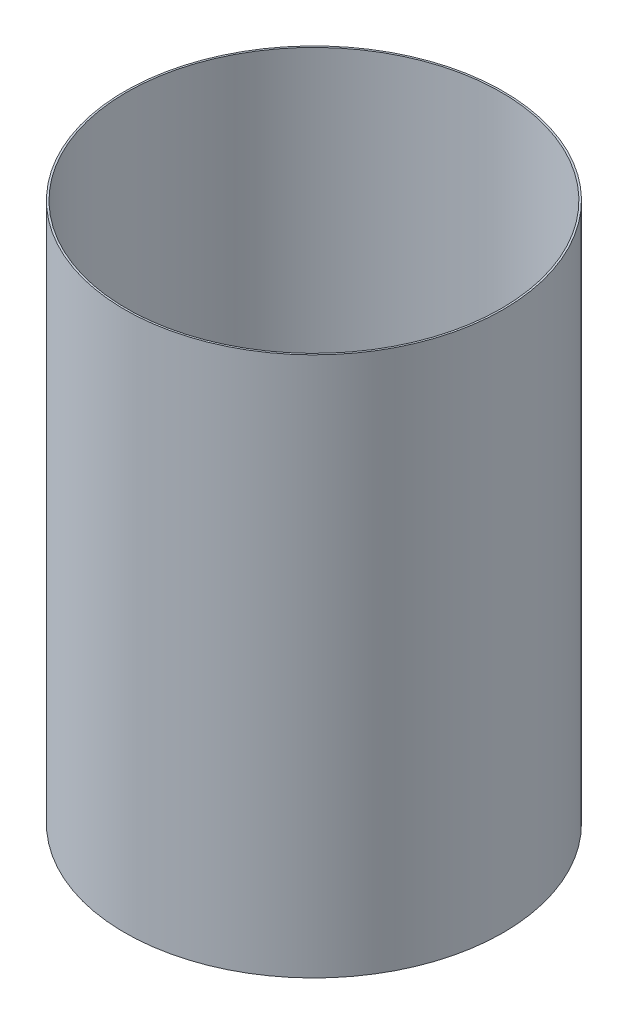
ISO-10303-21;
HEADER;
FILE_DESCRIPTION(('STEP AP214'),'2;1');
FILE_NAME('part.step','',(''),(''),'','','');
FILE_SCHEMA(('AUTOMOTIVE_DESIGN { 1 0 10303 214 1 1 1 1 }'));
ENDSEC;
DATA;
#1=APPLICATION_CONTEXT('core data for automotive mechanical design processes');
#2=APPLICATION_PROTOCOL_DEFINITION('international standard','automotive_design',2000,#1);
#3=PRODUCT_CONTEXT('',#1,'mechanical');
#4=PRODUCT('Part','Part','',(#3));
#5=PRODUCT_RELATED_PRODUCT_CATEGORY('part','',(#4));
#6=PRODUCT_DEFINITION_FORMATION('','',#4);
#7=PRODUCT_DEFINITION_CONTEXT('part definition',#1,'design');
#8=PRODUCT_DEFINITION('design','',#6,#7);
#9=PRODUCT_DEFINITION_SHAPE('','',#8);
#10=(LENGTH_UNIT() NAMED_UNIT(*) SI_UNIT(.MILLI.,.METRE.));
#11=(NAMED_UNIT(*) PLANE_ANGLE_UNIT() SI_UNIT($,.RADIAN.));
#12=(NAMED_UNIT(*) SI_UNIT($,.STERADIAN.) SOLID_ANGLE_UNIT());
#13=UNCERTAINTY_MEASURE_WITH_UNIT(LENGTH_MEASURE(1.E-05),#10,'distance_accuracy_value','');
#14=(GEOMETRIC_REPRESENTATION_CONTEXT(3) GLOBAL_UNCERTAINTY_ASSIGNED_CONTEXT((#13)) GLOBAL_UNIT_ASSIGNED_CONTEXT((#10,
#11,#12)) REPRESENTATION_CONTEXT('',''));
#15=CARTESIAN_POINT('',(0.,0.,0.));
#16=DIRECTION('',(0.,0.,1.));
#17=DIRECTION('',(1.,0.,0.));
#18=AXIS2_PLACEMENT_3D('',#15,#16,#17);
#19=CARTESIAN_POINT('',(63.1,-180.,0.));
#20=DIRECTION('',(0.,-1.,0.));
#21=DIRECTION('',(0.,0.,-1.));
#22=AXIS2_PLACEMENT_3D('',#19,#20,#21);
#23=PLANE('',#22);
#24=CARTESIAN_POINT('',(63.1,-180.,0.));
#25=DIRECTION('',(0.,-1.,0.));
#26=DIRECTION('',(-1.,0.,0.));
#27=AXIS2_PLACEMENT_3D('',#24,#25,#26);
#28=CIRCLE('',#27,62.5);
#29=CARTESIAN_POINT('',(125.6,-180.,0.));
#30=VERTEX_POINT('',#29);
#31=EDGE_CURVE('E11',#30,#30,#28,.T.);
#32=ORIENTED_EDGE('',*,*,#31,.F.);
#33=EDGE_LOOP('',(#32));
#34=FACE_BOUND('',#33,.T.);
#35=CARTESIAN_POINT('',(63.1,-180.,0.));
#36=DIRECTION('',(0.,1.,0.));
#37=DIRECTION('',(-1.,0.,0.));
#38=AXIS2_PLACEMENT_3D('',#35,#36,#37);
#39=CIRCLE('',#38,63.1);
#40=CARTESIAN_POINT('',(126.2,-180.,0.));
#41=VERTEX_POINT('',#40);
#42=EDGE_CURVE('E56',#41,#41,#39,.T.);
#43=ORIENTED_EDGE('',*,*,#42,.F.);
#44=EDGE_LOOP('',(#43));
#45=FACE_BOUND('',#44,.T.);
#46=ADVANCED_FACE('F17',(#34,#45),#23,.T.);
#47=CARTESIAN_POINT('',(63.1,9.,0.));
#48=DIRECTION('',(0.,-1.,0.));
#49=DIRECTION('',(-1.,0.,0.));
#50=AXIS2_PLACEMENT_3D('',#47,#48,#49);
#51=CYLINDRICAL_SURFACE('',#50,62.5);
#52=CARTESIAN_POINT('',(63.1,0.,0.));
#53=DIRECTION('',(0.,-1.,0.));
#54=DIRECTION('',(-1.,0.,0.));
#55=AXIS2_PLACEMENT_3D('',#52,#53,#54);
#56=CIRCLE('',#55,62.5);
#57=CARTESIAN_POINT('',(125.6,0.,0.));
#58=VERTEX_POINT('',#57);
#59=EDGE_CURVE('E66',#58,#58,#56,.T.);
#60=ORIENTED_EDGE('',*,*,#59,.F.);
#61=DIRECTION('',(0.,-1.,0.));
#62=VECTOR('',#61,1.);
#63=CARTESIAN_POINT('',(125.6,9.,0.));
#64=LINE('',#63,#62);
#65=EDGE_CURVE('E26',#58,#30,#64,.T.);
#66=ORIENTED_EDGE('',*,*,#65,.T.);
#67=ORIENTED_EDGE('',*,*,#31,.T.);
#68=ORIENTED_EDGE('',*,*,#65,.F.);
#69=EDGE_LOOP('',(#60,#66,#67,#68));
#70=FACE_BOUND('',#69,.T.);
#71=ADVANCED_FACE('F77',(#70),#51,.F.);
#72=CARTESIAN_POINT('',(63.1,0.,0.));
#73=DIRECTION('',(0.,-1.,0.));
#74=DIRECTION('',(0.,0.,-1.));
#75=AXIS2_PLACEMENT_3D('',#72,#73,#74);
#76=PLANE('',#75);
#77=ORIENTED_EDGE('',*,*,#59,.T.);
#78=EDGE_LOOP('',(#77));
#79=FACE_BOUND('',#78,.T.);
#80=CARTESIAN_POINT('',(63.1,0.,0.));
#81=DIRECTION('',(0.,-1.,0.));
#82=DIRECTION('',(-1.,0.,0.));
#83=AXIS2_PLACEMENT_3D('',#80,#81,#82);
#84=CIRCLE('',#83,63.1);
#85=CARTESIAN_POINT('',(126.2,0.,0.));
#86=VERTEX_POINT('',#85);
#87=EDGE_CURVE('E58',#86,#86,#84,.T.);
#88=ORIENTED_EDGE('',*,*,#87,.F.);
#89=EDGE_LOOP('',(#88));
#90=FACE_BOUND('',#89,.T.);
#91=ADVANCED_FACE('F19',(#79,#90),#76,.F.);
#92=CARTESIAN_POINT('',(63.1,9.,0.));
#93=DIRECTION('',(0.,-1.,0.));
#94=DIRECTION('',(-1.,0.,0.));
#95=AXIS2_PLACEMENT_3D('',#92,#93,#94);
#96=CYLINDRICAL_SURFACE('',#95,63.1);
#97=ORIENTED_EDGE('',*,*,#42,.T.);
#98=DIRECTION('',(0.,1.,0.));
#99=VECTOR('',#98,1.);
#100=CARTESIAN_POINT('',(126.2,9.,0.));
#101=LINE('',#100,#99);
#102=EDGE_CURVE('E53',#41,#86,#101,.T.);
#103=ORIENTED_EDGE('',*,*,#102,.T.);
#104=ORIENTED_EDGE('',*,*,#87,.T.);
#105=ORIENTED_EDGE('',*,*,#102,.F.);
#106=EDGE_LOOP('',(#97,#103,#104,#105));
#107=FACE_BOUND('',#106,.T.);
#108=ADVANCED_FACE('F54',(#107),#96,.T.);
#109=CLOSED_SHELL('',(#46,#71,#91,#108));
#110=MANIFOLD_SOLID_BREP('B1',#109);
#111=ADVANCED_BREP_SHAPE_REPRESENTATION('',(#18,#110),#14);
#112=SHAPE_DEFINITION_REPRESENTATION(#9,#111);
ENDSEC;
END-ISO-10303-21;
